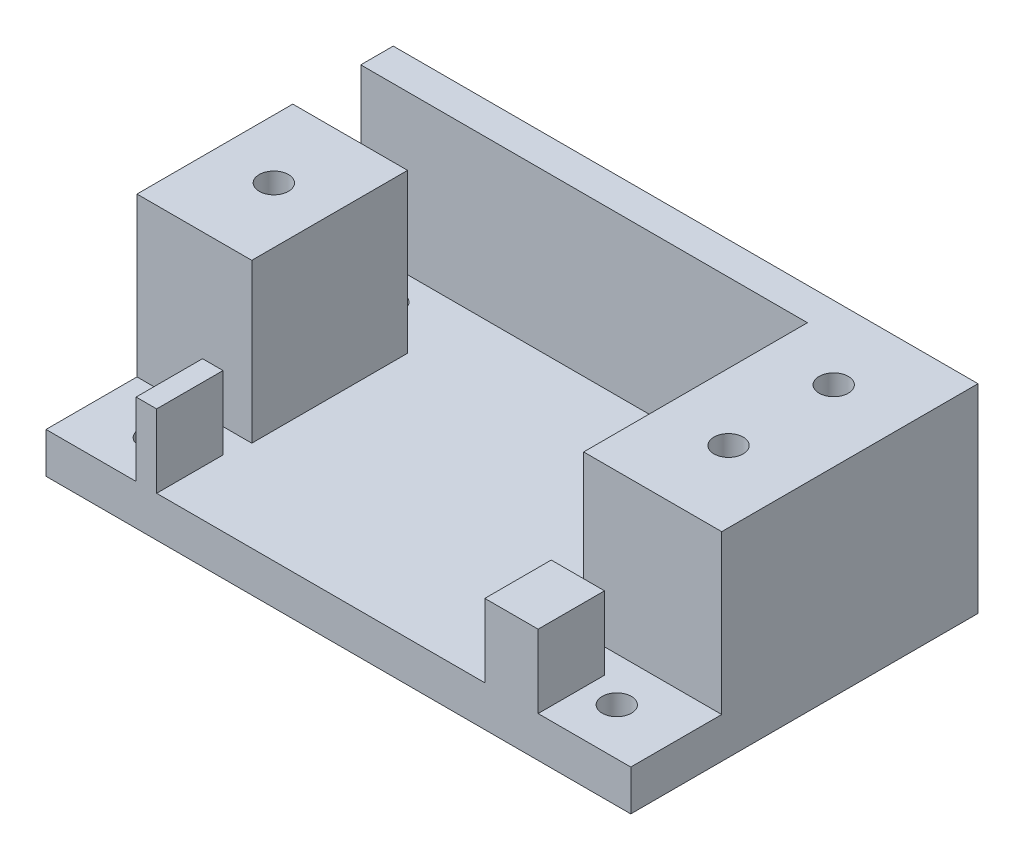
ISO-10303-21;
HEADER;
FILE_DESCRIPTION(('STEP AP214'),'2;1');
FILE_NAME('part.step','',(''),(''),'','','');
FILE_SCHEMA(('AUTOMOTIVE_DESIGN { 1 0 10303 214 1 1 1 1 }'));
ENDSEC;
DATA;
#1=APPLICATION_CONTEXT('core data for automotive mechanical design processes');
#2=APPLICATION_PROTOCOL_DEFINITION('international standard','automotive_design',2000,#1);
#3=PRODUCT_CONTEXT('',#1,'mechanical');
#4=PRODUCT('Part','Part','',(#3));
#5=PRODUCT_RELATED_PRODUCT_CATEGORY('part','',(#4));
#6=PRODUCT_DEFINITION_FORMATION('','',#4);
#7=PRODUCT_DEFINITION_CONTEXT('part definition',#1,'design');
#8=PRODUCT_DEFINITION('design','',#6,#7);
#9=PRODUCT_DEFINITION_SHAPE('','',#8);
#10=(LENGTH_UNIT() NAMED_UNIT(*) SI_UNIT(.MILLI.,.METRE.));
#11=(NAMED_UNIT(*) PLANE_ANGLE_UNIT() SI_UNIT($,.RADIAN.));
#12=(NAMED_UNIT(*) SI_UNIT($,.STERADIAN.) SOLID_ANGLE_UNIT());
#13=UNCERTAINTY_MEASURE_WITH_UNIT(LENGTH_MEASURE(1.E-05),#10,'distance_accuracy_value','');
#14=(GEOMETRIC_REPRESENTATION_CONTEXT(3) GLOBAL_UNCERTAINTY_ASSIGNED_CONTEXT((#13)) GLOBAL_UNIT_ASSIGNED_CONTEXT((#10,
#11,#12)) REPRESENTATION_CONTEXT('',''));
#15=CARTESIAN_POINT('',(0.,0.,0.));
#16=DIRECTION('',(0.,0.,1.));
#17=DIRECTION('',(1.,0.,0.));
#18=AXIS2_PLACEMENT_3D('',#15,#16,#17);
#19=CARTESIAN_POINT('',(0.,5.,0.));
#20=DIRECTION('',(0.,-1.,0.));
#21=DIRECTION('',(0.,0.,-1.));
#22=AXIS2_PLACEMENT_3D('',#19,#20,#21);
#23=PLANE('',#22);
#24=CARTESIAN_POINT('',(7.5,5.,-34.6484862574861));
#25=DIRECTION('',(0.,-1.,0.));
#26=DIRECTION('',(0.,0.,-1.));
#27=AXIS2_PLACEMENT_3D('',#24,#25,#26);
#28=CIRCLE('',#27,1.8);
#29=CARTESIAN_POINT('',(7.5,5.,-36.4484862574861));
#30=VERTEX_POINT('',#29);
#31=EDGE_CURVE('E237',#30,#30,#28,.T.);
#32=ORIENTED_EDGE('',*,*,#31,.T.);
#33=EDGE_LOOP('',(#32));
#34=FACE_BOUND('',#33,.T.);
#35=CARTESIAN_POINT('',(7.5,5.,-5.77830446336364));
#36=DIRECTION('',(0.,-1.,0.));
#37=DIRECTION('',(0.,0.,-1.));
#38=AXIS2_PLACEMENT_3D('',#35,#36,#37);
#39=CIRCLE('',#38,1.8);
#40=CARTESIAN_POINT('',(7.5,5.,-7.57830446336364));
#41=VERTEX_POINT('',#40);
#42=EDGE_CURVE('E234',#41,#41,#39,.T.);
#43=ORIENTED_EDGE('',*,*,#42,.T.);
#44=EDGE_LOOP('',(#43));
#45=FACE_BOUND('',#44,.T.);
#46=CARTESIAN_POINT('',(64.5,5.,-5.77830446336364));
#47=DIRECTION('',(0.,-1.,0.));
#48=DIRECTION('',(0.,0.,-1.));
#49=AXIS2_PLACEMENT_3D('',#46,#47,#48);
#50=CIRCLE('',#49,1.79999999999999);
#51=CARTESIAN_POINT('',(64.5,5.,-7.57830446336364));
#52=VERTEX_POINT('',#51);
#53=EDGE_CURVE('E230',#52,#52,#50,.T.);
#54=ORIENTED_EDGE('',*,*,#53,.T.);
#55=EDGE_LOOP('',(#54));
#56=FACE_BOUND('',#55,.T.);
#57=DIRECTION('',(0.,0.,1.));
#58=VECTOR('',#57,1.);
#59=CARTESIAN_POINT('',(54.030387781093,5.,-8.17719387321514));
#60=LINE('',#59,#58);
#61=CARTESIAN_POINT('',(54.030387781093,5.,-8.17719387321514));
#62=VERTEX_POINT('',#61);
#63=CARTESIAN_POINT('',(54.030387781093,5.,0.));
#64=VERTEX_POINT('',#63);
#65=EDGE_CURVE('E52',#62,#64,#60,.T.);
#66=ORIENTED_EDGE('',*,*,#65,.F.);
#67=DIRECTION('',(-1.,0.,0.));
#68=VECTOR('',#67,1.);
#69=CARTESIAN_POINT('',(54.030387781093,5.,-8.17719387321514));
#70=LINE('',#69,#68);
#71=CARTESIAN_POINT('',(60.5940121736773,5.,-8.17719387321514));
#72=VERTEX_POINT('',#71);
#73=EDGE_CURVE('E56',#72,#62,#70,.T.);
#74=ORIENTED_EDGE('',*,*,#73,.F.);
#75=DIRECTION('',(0.,0.,-1.));
#76=VECTOR('',#75,1.);
#77=CARTESIAN_POINT('',(60.5940121736773,5.,-8.17719387321514));
#78=LINE('',#77,#76);
#79=CARTESIAN_POINT('',(60.5940121736773,5.,0.));
#80=VERTEX_POINT('',#79);
#81=EDGE_CURVE('E363',#80,#72,#78,.T.);
#82=ORIENTED_EDGE('',*,*,#81,.F.);
#83=DIRECTION('',(1.,0.,0.));
#84=VECTOR('',#83,1.);
#85=CARTESIAN_POINT('',(0.,5.,0.));
#86=LINE('',#85,#84);
#87=CARTESIAN_POINT('',(72.,5.,0.));
#88=VERTEX_POINT('',#87);
#89=EDGE_CURVE('E314',#80,#88,#86,.T.);
#90=ORIENTED_EDGE('',*,*,#89,.T.);
#91=DIRECTION('',(0.,0.,-1.));
#92=VECTOR('',#91,1.);
#93=CARTESIAN_POINT('',(72.,5.,0.));
#94=LINE('',#93,#92);
#95=CARTESIAN_POINT('',(72.,5.,-11.2));
#96=VERTEX_POINT('',#95);
#97=EDGE_CURVE('E318',#88,#96,#94,.T.);
#98=ORIENTED_EDGE('',*,*,#97,.T.);
#99=DIRECTION('',(-1.,0.,0.));
#100=VECTOR('',#99,1.);
#101=CARTESIAN_POINT('',(0.,5.,-11.2));
#102=LINE('',#101,#100);
#103=CARTESIAN_POINT('',(55.,5.,-11.2));
#104=VERTEX_POINT('',#103);
#105=EDGE_CURVE('E278',#96,#104,#102,.T.);
#106=ORIENTED_EDGE('',*,*,#105,.T.);
#107=DIRECTION('',(0.,0.,1.));
#108=VECTOR('',#107,1.);
#109=CARTESIAN_POINT('',(55.,5.,0.));
#110=LINE('',#109,#108);
#111=CARTESIAN_POINT('',(55.,5.,-38.7549792026346));
#112=VERTEX_POINT('',#111);
#113=EDGE_CURVE('E275',#112,#104,#110,.T.);
#114=ORIENTED_EDGE('',*,*,#113,.F.);
#115=DIRECTION('',(1.,0.,0.));
#116=VECTOR('',#115,1.);
#117=CARTESIAN_POINT('',(0.,5.,-38.7549792026346));
#118=LINE('',#117,#116);
#119=CARTESIAN_POINT('',(0.,5.,-38.7549792026346));
#120=VERTEX_POINT('',#119);
#121=EDGE_CURVE('E280',#120,#112,#118,.T.);
#122=ORIENTED_EDGE('',*,*,#121,.F.);
#123=DIRECTION('',(0.,0.,1.));
#124=VECTOR('',#123,1.);
#125=CARTESIAN_POINT('',(0.,5.,0.));
#126=LINE('',#125,#124);
#127=CARTESIAN_POINT('',(0.,5.,-30.3868534551371));
#128=VERTEX_POINT('',#127);
#129=EDGE_CURVE('E312',#120,#128,#126,.T.);
#130=ORIENTED_EDGE('',*,*,#129,.T.);
#131=DIRECTION('',(1.,0.,0.));
#132=VECTOR('',#131,1.);
#133=CARTESIAN_POINT('',(0.,5.,-30.3868534551371));
#134=LINE('',#133,#132);
#135=CARTESIAN_POINT('',(14.1358984015401,5.,-30.3868534551371));
#136=VERTEX_POINT('',#135);
#137=EDGE_CURVE('E298',#128,#136,#134,.T.);
#138=ORIENTED_EDGE('',*,*,#137,.T.);
#139=DIRECTION('',(0.,0.,1.));
#140=VECTOR('',#139,1.);
#141=CARTESIAN_POINT('',(14.1358984015401,5.,0.));
#142=LINE('',#141,#140);
#143=CARTESIAN_POINT('',(14.1358984015401,5.,-11.1999999999585));
#144=VERTEX_POINT('',#143);
#145=EDGE_CURVE('E308',#136,#144,#142,.T.);
#146=ORIENTED_EDGE('',*,*,#145,.T.);
#147=DIRECTION('',(1.,0.,0.));
#148=VECTOR('',#147,1.);
#149=CARTESIAN_POINT('',(0.,5.,-11.1999999999585));
#150=LINE('',#149,#148);
#151=CARTESIAN_POINT('',(0.,5.,-11.1999999999585));
#152=VERTEX_POINT('',#151);
#153=EDGE_CURVE('E306',#152,#144,#150,.T.);
#154=ORIENTED_EDGE('',*,*,#153,.F.);
#155=CARTESIAN_POINT('',(0.,5.,0.));
#156=VERTEX_POINT('',#155);
#157=EDGE_CURVE('E315',#152,#156,#126,.T.);
#158=ORIENTED_EDGE('',*,*,#157,.T.);
#159=CARTESIAN_POINT('',(11.0932438057328,5.,0.));
#160=VERTEX_POINT('',#159);
#161=EDGE_CURVE('E316',#156,#160,#86,.T.);
#162=ORIENTED_EDGE('',*,*,#161,.T.);
#163=DIRECTION('',(0.,0.,1.));
#164=VECTOR('',#163,1.);
#165=CARTESIAN_POINT('',(11.0932438057328,5.,-8.17719387321514));
#166=LINE('',#165,#164);
#167=CARTESIAN_POINT('',(11.0932438057328,5.,-8.17719387321514));
#168=VERTEX_POINT('',#167);
#169=EDGE_CURVE('E194',#168,#160,#166,.T.);
#170=ORIENTED_EDGE('',*,*,#169,.F.);
#171=DIRECTION('',(-1.,0.,0.));
#172=VECTOR('',#171,1.);
#173=CARTESIAN_POINT('',(11.0932438057328,5.,-8.17719387321514));
#174=LINE('',#173,#172);
#175=CARTESIAN_POINT('',(13.620480519598,5.,-8.17719387321514));
#176=VERTEX_POINT('',#175);
#177=EDGE_CURVE('E207',#176,#168,#174,.T.);
#178=ORIENTED_EDGE('',*,*,#177,.F.);
#179=DIRECTION('',(0.,0.,-1.));
#180=VECTOR('',#179,1.);
#181=CARTESIAN_POINT('',(13.620480519598,5.,-8.17719387321514));
#182=LINE('',#181,#180);
#183=CARTESIAN_POINT('',(13.620480519598,5.,0.));
#184=VERTEX_POINT('',#183);
#185=EDGE_CURVE('E197',#184,#176,#182,.T.);
#186=ORIENTED_EDGE('',*,*,#185,.F.);
#187=EDGE_CURVE('E319',#184,#64,#86,.T.);
#188=ORIENTED_EDGE('',*,*,#187,.T.);
#189=EDGE_LOOP('',(#66,#74,#82,#90,#98,#106,#114,#122,#130,#138,#146,#154,#158,#162,#170,#178,
#186,#188));
#190=FACE_BOUND('',#189,.T.);
#191=ADVANCED_FACE('F35',(#34,#45,#56,#190),#23,.F.);
#192=CARTESIAN_POINT('',(0.,5.,0.));
#193=DIRECTION('',(1.,0.,0.));
#194=DIRECTION('',(0.,0.,-1.));
#195=AXIS2_PLACEMENT_3D('',#192,#193,#194);
#196=PLANE('',#195);
#197=ORIENTED_EDGE('',*,*,#129,.F.);
#198=DIRECTION('',(0.,-1.,0.));
#199=VECTOR('',#198,1.);
#200=CARTESIAN_POINT('',(0.,24.5,-38.7549792026346));
#201=LINE('',#200,#199);
#202=CARTESIAN_POINT('',(0.,24.5,-38.7549792026346));
#203=VERTEX_POINT('',#202);
#204=EDGE_CURVE('E254',#203,#120,#201,.T.);
#205=ORIENTED_EDGE('',*,*,#204,.F.);
#206=DIRECTION('',(0.,0.,1.));
#207=VECTOR('',#206,1.);
#208=CARTESIAN_POINT('',(0.,24.5,-42.7549792026346));
#209=LINE('',#208,#207);
#210=CARTESIAN_POINT('',(0.,24.5,-42.7549792026346));
#211=VERTEX_POINT('',#210);
#212=EDGE_CURVE('E269',#211,#203,#209,.T.);
#213=ORIENTED_EDGE('',*,*,#212,.F.);
#214=DIRECTION('',(0.,-1.,0.));
#215=VECTOR('',#214,1.);
#216=CARTESIAN_POINT('',(0.,24.5,-42.7549792026346));
#217=LINE('',#216,#215);
#218=CARTESIAN_POINT('',(0.,0.,-42.7549792026346));
#219=VERTEX_POINT('',#218);
#220=EDGE_CURVE('E260',#211,#219,#217,.T.);
#221=ORIENTED_EDGE('',*,*,#220,.T.);
#222=DIRECTION('',(0.,0.,1.));
#223=VECTOR('',#222,1.);
#224=CARTESIAN_POINT('',(0.,0.,0.));
#225=LINE('',#224,#223);
#226=CARTESIAN_POINT('',(0.,0.,0.));
#227=VERTEX_POINT('',#226);
#228=EDGE_CURVE('E311',#219,#227,#225,.T.);
#229=ORIENTED_EDGE('',*,*,#228,.T.);
#230=DIRECTION('',(0.,-1.,0.));
#231=VECTOR('',#230,1.);
#232=CARTESIAN_POINT('',(0.,5.,0.));
#233=LINE('',#232,#231);
#234=EDGE_CURVE('E11',#156,#227,#233,.T.);
#235=ORIENTED_EDGE('',*,*,#234,.F.);
#236=ORIENTED_EDGE('',*,*,#157,.F.);
#237=DIRECTION('',(0.,1.,0.));
#238=VECTOR('',#237,1.);
#239=CARTESIAN_POINT('',(0.,0.,-11.1999999999585));
#240=LINE('',#239,#238);
#241=CARTESIAN_POINT('',(0.,24.5,-11.1999999999585));
#242=VERTEX_POINT('',#241);
#243=EDGE_CURVE('E299',#152,#242,#240,.T.);
#244=ORIENTED_EDGE('',*,*,#243,.T.);
#245=DIRECTION('',(0.,0.,1.));
#246=VECTOR('',#245,1.);
#247=CARTESIAN_POINT('',(0.,24.5,0.));
#248=LINE('',#247,#246);
#249=CARTESIAN_POINT('',(0.,24.5,-30.3868534551371));
#250=VERTEX_POINT('',#249);
#251=EDGE_CURVE('E289',#250,#242,#248,.T.);
#252=ORIENTED_EDGE('',*,*,#251,.F.);
#253=DIRECTION('',(0.,1.,0.));
#254=VECTOR('',#253,1.);
#255=CARTESIAN_POINT('',(0.,0.,-30.3868534551371));
#256=LINE('',#255,#254);
#257=EDGE_CURVE('E301',#128,#250,#256,.T.);
#258=ORIENTED_EDGE('',*,*,#257,.F.);
#259=EDGE_LOOP('',(#197,#205,#213,#221,#229,#235,#236,#244,#252,#258));
#260=FACE_BOUND('',#259,.T.);
#261=ADVANCED_FACE('F37',(#260),#196,.F.);
#262=CARTESIAN_POINT('',(0.,5.,0.));
#263=DIRECTION('',(0.,0.,-1.));
#264=DIRECTION('',(-1.,0.,0.));
#265=AXIS2_PLACEMENT_3D('',#262,#263,#264);
#266=PLANE('',#265);
#267=DIRECTION('',(1.,0.,0.));
#268=VECTOR('',#267,1.);
#269=CARTESIAN_POINT('',(0.,0.,0.));
#270=LINE('',#269,#268);
#271=CARTESIAN_POINT('',(72.,0.,0.));
#272=VERTEX_POINT('',#271);
#273=EDGE_CURVE('E322',#227,#272,#270,.T.);
#274=ORIENTED_EDGE('',*,*,#273,.T.);
#275=DIRECTION('',(0.,-1.,0.));
#276=VECTOR('',#275,1.);
#277=CARTESIAN_POINT('',(72.,5.,0.));
#278=LINE('',#277,#276);
#279=EDGE_CURVE('E44',#88,#272,#278,.T.);
#280=ORIENTED_EDGE('',*,*,#279,.F.);
#281=ORIENTED_EDGE('',*,*,#89,.F.);
#282=DIRECTION('',(0.,-1.,0.));
#283=VECTOR('',#282,1.);
#284=CARTESIAN_POINT('',(60.5940121736773,14.,0.));
#285=LINE('',#284,#283);
#286=CARTESIAN_POINT('',(60.5940121736773,14.,0.));
#287=VERTEX_POINT('',#286);
#288=EDGE_CURVE('E179',#287,#80,#285,.T.);
#289=ORIENTED_EDGE('',*,*,#288,.F.);
#290=DIRECTION('',(1.,0.,0.));
#291=VECTOR('',#290,1.);
#292=CARTESIAN_POINT('',(54.030387781093,14.,0.));
#293=LINE('',#292,#291);
#294=CARTESIAN_POINT('',(54.030387781093,14.,0.));
#295=VERTEX_POINT('',#294);
#296=EDGE_CURVE('E173',#295,#287,#293,.T.);
#297=ORIENTED_EDGE('',*,*,#296,.F.);
#298=DIRECTION('',(0.,-1.,0.));
#299=VECTOR('',#298,1.);
#300=CARTESIAN_POINT('',(54.030387781093,14.,0.));
#301=LINE('',#300,#299);
#302=EDGE_CURVE('E177',#295,#64,#301,.T.);
#303=ORIENTED_EDGE('',*,*,#302,.T.);
#304=ORIENTED_EDGE('',*,*,#187,.F.);
#305=DIRECTION('',(0.,-1.,0.));
#306=VECTOR('',#305,1.);
#307=CARTESIAN_POINT('',(13.620480519598,14.,0.));
#308=LINE('',#307,#306);
#309=CARTESIAN_POINT('',(13.620480519598,14.,0.));
#310=VERTEX_POINT('',#309);
#311=EDGE_CURVE('E223',#310,#184,#308,.T.);
#312=ORIENTED_EDGE('',*,*,#311,.F.);
#313=DIRECTION('',(1.,0.,0.));
#314=VECTOR('',#313,1.);
#315=CARTESIAN_POINT('',(11.0932438057328,14.,0.));
#316=LINE('',#315,#314);
#317=CARTESIAN_POINT('',(11.0932438057328,14.,0.));
#318=VERTEX_POINT('',#317);
#319=EDGE_CURVE('E206',#318,#310,#316,.T.);
#320=ORIENTED_EDGE('',*,*,#319,.F.);
#321=DIRECTION('',(0.,-1.,0.));
#322=VECTOR('',#321,1.);
#323=CARTESIAN_POINT('',(11.0932438057328,14.,0.));
#324=LINE('',#323,#322);
#325=EDGE_CURVE('E226',#318,#160,#324,.T.);
#326=ORIENTED_EDGE('',*,*,#325,.T.);
#327=ORIENTED_EDGE('',*,*,#161,.F.);
#328=ORIENTED_EDGE('',*,*,#234,.T.);
#329=EDGE_LOOP('',(#274,#280,#281,#289,#297,#303,#304,#312,#320,#326,#327,#328));
#330=FACE_BOUND('',#329,.T.);
#331=ADVANCED_FACE('F175',(#330),#266,.F.);
#332=CARTESIAN_POINT('',(72.,5.,0.));
#333=DIRECTION('',(-1.,0.,0.));
#334=DIRECTION('',(0.,0.,1.));
#335=AXIS2_PLACEMENT_3D('',#332,#333,#334);
#336=PLANE('',#335);
#337=DIRECTION('',(0.,1.,0.));
#338=VECTOR('',#337,1.);
#339=CARTESIAN_POINT('',(72.,0.,-11.2));
#340=LINE('',#339,#338);
#341=CARTESIAN_POINT('',(72.,24.5,-11.2));
#342=VERTEX_POINT('',#341);
#343=EDGE_CURVE('E240',#96,#342,#340,.T.);
#344=ORIENTED_EDGE('',*,*,#343,.F.);
#345=ORIENTED_EDGE('',*,*,#97,.F.);
#346=ORIENTED_EDGE('',*,*,#279,.T.);
#347=DIRECTION('',(0.,0.,-1.));
#348=VECTOR('',#347,1.);
#349=CARTESIAN_POINT('',(72.,0.,0.));
#350=LINE('',#349,#348);
#351=CARTESIAN_POINT('',(72.,0.,-42.7549792026346));
#352=VERTEX_POINT('',#351);
#353=EDGE_CURVE('E324',#272,#352,#350,.T.);
#354=ORIENTED_EDGE('',*,*,#353,.T.);
#355=DIRECTION('',(0.,-1.,0.));
#356=VECTOR('',#355,1.);
#357=CARTESIAN_POINT('',(72.,24.5,-42.7549792026346));
#358=LINE('',#357,#356);
#359=CARTESIAN_POINT('',(72.,24.5,-42.7549792026346));
#360=VERTEX_POINT('',#359);
#361=EDGE_CURVE('E257',#360,#352,#358,.T.);
#362=ORIENTED_EDGE('',*,*,#361,.F.);
#363=DIRECTION('',(0.,0.,-1.));
#364=VECTOR('',#363,1.);
#365=CARTESIAN_POINT('',(72.,24.5,0.));
#366=LINE('',#365,#364);
#367=EDGE_CURVE('E243',#342,#360,#366,.T.);
#368=ORIENTED_EDGE('',*,*,#367,.F.);
#369=EDGE_LOOP('',(#344,#345,#346,#354,#362,#368));
#370=FACE_BOUND('',#369,.T.);
#371=ADVANCED_FACE('F339',(#370),#336,.F.);
#372=CARTESIAN_POINT('',(0.,0.,0.));
#373=DIRECTION('',(0.,-1.,0.));
#374=DIRECTION('',(0.,0.,-1.));
#375=AXIS2_PLACEMENT_3D('',#372,#373,#374);
#376=PLANE('',#375);
#377=CARTESIAN_POINT('',(7.2440769767815,0.,-20.8097057142761));
#378=DIRECTION('',(0.,-1.,0.));
#379=DIRECTION('',(0.,0.,-1.));
#380=AXIS2_PLACEMENT_3D('',#377,#378,#379);
#381=CIRCLE('',#380,1.8);
#382=CARTESIAN_POINT('',(7.2440769767815,0.,-22.6097057142761));
#383=VERTEX_POINT('',#382);
#384=EDGE_CURVE('E373',#383,#383,#381,.T.);
#385=ORIENTED_EDGE('',*,*,#384,.F.);
#386=EDGE_LOOP('',(#385));
#387=FACE_BOUND('',#386,.T.);
#388=CARTESIAN_POINT('',(63.2344456145826,0.,-20.8097057142761));
#389=DIRECTION('',(0.,-1.,0.));
#390=DIRECTION('',(0.,0.,-1.));
#391=AXIS2_PLACEMENT_3D('',#388,#389,#390);
#392=CIRCLE('',#391,1.79999999999999);
#393=CARTESIAN_POINT('',(63.2344456145826,0.,-22.6097057142761));
#394=VERTEX_POINT('',#393);
#395=EDGE_CURVE('E595',#394,#394,#392,.T.);
#396=ORIENTED_EDGE('',*,*,#395,.F.);
#397=EDGE_LOOP('',(#396));
#398=FACE_BOUND('',#397,.T.);
#399=CARTESIAN_POINT('',(63.2344456145826,0.,-33.7549792));
#400=DIRECTION('',(0.,-1.,0.));
#401=DIRECTION('',(0.,0.,-1.));
#402=AXIS2_PLACEMENT_3D('',#399,#400,#401);
#403=CIRCLE('',#402,1.79999999999999);
#404=CARTESIAN_POINT('',(63.2344456145826,0.,-35.5549792));
#405=VERTEX_POINT('',#404);
#406=EDGE_CURVE('E591',#405,#405,#403,.T.);
#407=ORIENTED_EDGE('',*,*,#406,.F.);
#408=EDGE_LOOP('',(#407));
#409=FACE_BOUND('',#408,.T.);
#410=CARTESIAN_POINT('',(7.5,0.,-34.6484862574861));
#411=DIRECTION('',(0.,-1.,0.));
#412=DIRECTION('',(0.,0.,-1.));
#413=AXIS2_PLACEMENT_3D('',#410,#411,#412);
#414=CIRCLE('',#413,1.8);
#415=CARTESIAN_POINT('',(7.5,0.,-36.4484862574861));
#416=VERTEX_POINT('',#415);
#417=EDGE_CURVE('E39',#416,#416,#414,.T.);
#418=ORIENTED_EDGE('',*,*,#417,.F.);
#419=EDGE_LOOP('',(#418));
#420=FACE_BOUND('',#419,.T.);
#421=CARTESIAN_POINT('',(7.5,0.,-5.77830446336364));
#422=DIRECTION('',(0.,-1.,0.));
#423=DIRECTION('',(0.,0.,-1.));
#424=AXIS2_PLACEMENT_3D('',#421,#422,#423);
#425=CIRCLE('',#424,1.8);
#426=CARTESIAN_POINT('',(7.5,0.,-7.57830446336364));
#427=VERTEX_POINT('',#426);
#428=EDGE_CURVE('E233',#427,#427,#425,.T.);
#429=ORIENTED_EDGE('',*,*,#428,.F.);
#430=EDGE_LOOP('',(#429));
#431=FACE_BOUND('',#430,.T.);
#432=CARTESIAN_POINT('',(64.5,0.,-5.77830446336364));
#433=DIRECTION('',(0.,-1.,0.));
#434=DIRECTION('',(0.,0.,-1.));
#435=AXIS2_PLACEMENT_3D('',#432,#433,#434);
#436=CIRCLE('',#435,1.79999999999999);
#437=CARTESIAN_POINT('',(64.5,0.,-7.57830446336364));
#438=VERTEX_POINT('',#437);
#439=EDGE_CURVE('E229',#438,#438,#436,.T.);
#440=ORIENTED_EDGE('',*,*,#439,.F.);
#441=EDGE_LOOP('',(#440));
#442=FACE_BOUND('',#441,.T.);
#443=ORIENTED_EDGE('',*,*,#273,.F.);
#444=ORIENTED_EDGE('',*,*,#228,.F.);
#445=DIRECTION('',(1.,0.,0.));
#446=VECTOR('',#445,1.);
#447=CARTESIAN_POINT('',(0.,0.,-42.7549792026346));
#448=LINE('',#447,#446);
#449=EDGE_CURVE('E272',#219,#352,#448,.T.);
#450=ORIENTED_EDGE('',*,*,#449,.T.);
#451=ORIENTED_EDGE('',*,*,#353,.F.);
#452=EDGE_LOOP('',(#443,#444,#450,#451));
#453=FACE_BOUND('',#452,.T.);
#454=ADVANCED_FACE('F335',(#387,#398,#409,#420,#431,#442,#453),#376,.T.);
#455=CARTESIAN_POINT('',(14.1358984015401,0.,0.));
#456=DIRECTION('',(1.,0.,0.));
#457=DIRECTION('',(0.,0.,-1.));
#458=AXIS2_PLACEMENT_3D('',#455,#456,#457);
#459=PLANE('',#458);
#460=ORIENTED_EDGE('',*,*,#145,.F.);
#461=DIRECTION('',(0.,1.,0.));
#462=VECTOR('',#461,1.);
#463=CARTESIAN_POINT('',(14.1358984015401,0.,-30.3868534551371));
#464=LINE('',#463,#462);
#465=CARTESIAN_POINT('',(14.1358984015401,24.5,-30.3868534551371));
#466=VERTEX_POINT('',#465);
#467=EDGE_CURVE('E295',#136,#466,#464,.T.);
#468=ORIENTED_EDGE('',*,*,#467,.T.);
#469=DIRECTION('',(0.,0.,-1.));
#470=VECTOR('',#469,1.);
#471=CARTESIAN_POINT('',(14.1358984015401,24.5,0.));
#472=LINE('',#471,#470);
#473=CARTESIAN_POINT('',(14.1358984015401,24.5,-11.1999999999585));
#474=VERTEX_POINT('',#473);
#475=EDGE_CURVE('E283',#474,#466,#472,.T.);
#476=ORIENTED_EDGE('',*,*,#475,.F.);
#477=DIRECTION('',(0.,1.,0.));
#478=VECTOR('',#477,1.);
#479=CARTESIAN_POINT('',(14.1358984015401,0.,-11.1999999999585));
#480=LINE('',#479,#478);
#481=EDGE_CURVE('E296',#144,#474,#480,.T.);
#482=ORIENTED_EDGE('',*,*,#481,.F.);
#483=EDGE_LOOP('',(#460,#468,#476,#482));
#484=FACE_BOUND('',#483,.T.);
#485=ADVANCED_FACE('F338',(#484),#459,.T.);
#486=CARTESIAN_POINT('',(0.,0.,-11.1999999999585));
#487=DIRECTION('',(0.,0.,-1.));
#488=DIRECTION('',(-1.,0.,0.));
#489=AXIS2_PLACEMENT_3D('',#486,#487,#488);
#490=PLANE('',#489);
#491=ORIENTED_EDGE('',*,*,#243,.F.);
#492=ORIENTED_EDGE('',*,*,#153,.T.);
#493=ORIENTED_EDGE('',*,*,#481,.T.);
#494=DIRECTION('',(-1.,0.,0.));
#495=VECTOR('',#494,1.);
#496=CARTESIAN_POINT('',(0.,24.5,-11.1999999999585));
#497=LINE('',#496,#495);
#498=EDGE_CURVE('E292',#474,#242,#497,.T.);
#499=ORIENTED_EDGE('',*,*,#498,.T.);
#500=EDGE_LOOP('',(#491,#492,#493,#499));
#501=FACE_BOUND('',#500,.T.);
#502=ADVANCED_FACE('F420',(#501),#490,.F.);
#503=CARTESIAN_POINT('',(0.,0.,-30.3868534551371));
#504=DIRECTION('',(0.,0.,-1.));
#505=DIRECTION('',(-1.,0.,0.));
#506=AXIS2_PLACEMENT_3D('',#503,#504,#505);
#507=PLANE('',#506);
#508=ORIENTED_EDGE('',*,*,#137,.F.);
#509=ORIENTED_EDGE('',*,*,#257,.T.);
#510=DIRECTION('',(-1.,0.,0.));
#511=VECTOR('',#510,1.);
#512=CARTESIAN_POINT('',(0.,24.5,-30.3868534551371));
#513=LINE('',#512,#511);
#514=EDGE_CURVE('E286',#466,#250,#513,.T.);
#515=ORIENTED_EDGE('',*,*,#514,.F.);
#516=ORIENTED_EDGE('',*,*,#467,.F.);
#517=EDGE_LOOP('',(#508,#509,#515,#516));
#518=FACE_BOUND('',#517,.T.);
#519=ADVANCED_FACE('F427',(#518),#507,.T.);
#520=CARTESIAN_POINT('',(0.,24.5,0.));
#521=DIRECTION('',(0.,1.,0.));
#522=DIRECTION('',(0.,0.,1.));
#523=AXIS2_PLACEMENT_3D('',#520,#521,#522);
#524=PLANE('',#523);
#525=CARTESIAN_POINT('',(7.2440769767815,24.5,-20.8097057142761));
#526=DIRECTION('',(0.,1.,0.));
#527=DIRECTION('',(0.,0.,1.));
#528=AXIS2_PLACEMENT_3D('',#525,#526,#527);
#529=CIRCLE('',#528,1.8);
#530=CARTESIAN_POINT('',(7.2440769767815,24.5,-19.0097057142761));
#531=VERTEX_POINT('',#530);
#532=EDGE_CURVE('E590',#531,#531,#529,.T.);
#533=ORIENTED_EDGE('',*,*,#532,.F.);
#534=EDGE_LOOP('',(#533));
#535=FACE_BOUND('',#534,.T.);
#536=ORIENTED_EDGE('',*,*,#475,.T.);
#537=ORIENTED_EDGE('',*,*,#514,.T.);
#538=ORIENTED_EDGE('',*,*,#251,.T.);
#539=ORIENTED_EDGE('',*,*,#498,.F.);
#540=EDGE_LOOP('',(#536,#537,#538,#539));
#541=FACE_BOUND('',#540,.T.);
#542=ADVANCED_FACE('F435',(#535,#541),#524,.T.);
#543=CARTESIAN_POINT('',(0.,24.5,-38.7549792026346));
#544=DIRECTION('',(0.,0.,-1.));
#545=DIRECTION('',(-1.,0.,0.));
#546=AXIS2_PLACEMENT_3D('',#543,#544,#545);
#547=PLANE('',#546);
#548=ORIENTED_EDGE('',*,*,#204,.T.);
#549=ORIENTED_EDGE('',*,*,#121,.T.);
#550=DIRECTION('',(0.,1.,0.));
#551=VECTOR('',#550,1.);
#552=CARTESIAN_POINT('',(55.,0.,-38.7549792026346));
#553=LINE('',#552,#551);
#554=CARTESIAN_POINT('',(55.,24.5,-38.7549792026346));
#555=VERTEX_POINT('',#554);
#556=EDGE_CURVE('E241',#112,#555,#553,.T.);
#557=ORIENTED_EDGE('',*,*,#556,.T.);
#558=DIRECTION('',(1.,0.,0.));
#559=VECTOR('',#558,1.);
#560=CARTESIAN_POINT('',(0.,24.5,-38.7549792026346));
#561=LINE('',#560,#559);
#562=EDGE_CURVE('E266',#203,#555,#561,.T.);
#563=ORIENTED_EDGE('',*,*,#562,.F.);
#564=EDGE_LOOP('',(#548,#549,#557,#563));
#565=FACE_BOUND('',#564,.T.);
#566=ADVANCED_FACE('F442',(#565),#547,.F.);
#567=CARTESIAN_POINT('',(0.,0.,-11.2));
#568=DIRECTION('',(0.,0.,1.));
#569=DIRECTION('',(1.,0.,0.));
#570=AXIS2_PLACEMENT_3D('',#567,#568,#569);
#571=PLANE('',#570);
#572=ORIENTED_EDGE('',*,*,#105,.F.);
#573=ORIENTED_EDGE('',*,*,#343,.T.);
#574=DIRECTION('',(1.,0.,0.));
#575=VECTOR('',#574,1.);
#576=CARTESIAN_POINT('',(0.,24.5,-11.2));
#577=LINE('',#576,#575);
#578=CARTESIAN_POINT('',(55.,24.5,-11.2));
#579=VERTEX_POINT('',#578);
#580=EDGE_CURVE('E248',#579,#342,#577,.T.);
#581=ORIENTED_EDGE('',*,*,#580,.F.);
#582=DIRECTION('',(0.,1.,0.));
#583=VECTOR('',#582,1.);
#584=CARTESIAN_POINT('',(55.,0.,-11.2));
#585=LINE('',#584,#583);
#586=EDGE_CURVE('E244',#104,#579,#585,.T.);
#587=ORIENTED_EDGE('',*,*,#586,.F.);
#588=EDGE_LOOP('',(#572,#573,#581,#587));
#589=FACE_BOUND('',#588,.T.);
#590=ADVANCED_FACE('F450',(#589),#571,.T.);
#591=CARTESIAN_POINT('',(55.,0.,0.));
#592=DIRECTION('',(1.,0.,0.));
#593=DIRECTION('',(0.,0.,-1.));
#594=AXIS2_PLACEMENT_3D('',#591,#592,#593);
#595=PLANE('',#594);
#596=ORIENTED_EDGE('',*,*,#556,.F.);
#597=ORIENTED_EDGE('',*,*,#113,.T.);
#598=ORIENTED_EDGE('',*,*,#586,.T.);
#599=DIRECTION('',(0.,0.,-1.));
#600=VECTOR('',#599,1.);
#601=CARTESIAN_POINT('',(55.,24.5,0.));
#602=LINE('',#601,#600);
#603=EDGE_CURVE('E251',#579,#555,#602,.T.);
#604=ORIENTED_EDGE('',*,*,#603,.T.);
#605=EDGE_LOOP('',(#596,#597,#598,#604));
#606=FACE_BOUND('',#605,.T.);
#607=ADVANCED_FACE('F458',(#606),#595,.F.);
#608=CARTESIAN_POINT('',(0.,24.5,0.));
#609=DIRECTION('',(0.,1.,0.));
#610=DIRECTION('',(0.,0.,1.));
#611=AXIS2_PLACEMENT_3D('',#608,#609,#610);
#612=PLANE('',#611);
#613=CARTESIAN_POINT('',(63.2344456145826,24.5,-20.8097057142761));
#614=DIRECTION('',(0.,1.,0.));
#615=DIRECTION('',(0.,0.,1.));
#616=AXIS2_PLACEMENT_3D('',#613,#614,#615);
#617=CIRCLE('',#616,1.79999999999999);
#618=CARTESIAN_POINT('',(63.2344456145826,24.5,-19.0097057142761));
#619=VERTEX_POINT('',#618);
#620=EDGE_CURVE('E592',#619,#619,#617,.T.);
#621=ORIENTED_EDGE('',*,*,#620,.F.);
#622=EDGE_LOOP('',(#621));
#623=FACE_BOUND('',#622,.T.);
#624=CARTESIAN_POINT('',(63.2344456145826,24.5,-33.7549792));
#625=DIRECTION('',(0.,1.,0.));
#626=DIRECTION('',(0.,0.,1.));
#627=AXIS2_PLACEMENT_3D('',#624,#625,#626);
#628=CIRCLE('',#627,1.79999999999999);
#629=CARTESIAN_POINT('',(63.2344456145826,24.5,-31.9549792));
#630=VERTEX_POINT('',#629);
#631=EDGE_CURVE('E598',#630,#630,#628,.T.);
#632=ORIENTED_EDGE('',*,*,#631,.F.);
#633=EDGE_LOOP('',(#632));
#634=FACE_BOUND('',#633,.T.);
#635=ORIENTED_EDGE('',*,*,#367,.T.);
#636=DIRECTION('',(1.,0.,0.));
#637=VECTOR('',#636,1.);
#638=CARTESIAN_POINT('',(0.,24.5,-42.7549792026346));
#639=LINE('',#638,#637);
#640=EDGE_CURVE('E263',#211,#360,#639,.T.);
#641=ORIENTED_EDGE('',*,*,#640,.F.);
#642=ORIENTED_EDGE('',*,*,#212,.T.);
#643=ORIENTED_EDGE('',*,*,#562,.T.);
#644=ORIENTED_EDGE('',*,*,#603,.F.);
#645=ORIENTED_EDGE('',*,*,#580,.T.);
#646=EDGE_LOOP('',(#635,#641,#642,#643,#644,#645));
#647=FACE_BOUND('',#646,.T.);
#648=ADVANCED_FACE('F466',(#623,#634,#647),#612,.T.);
#649=CARTESIAN_POINT('',(0.,24.5,-42.7549792026346));
#650=DIRECTION('',(0.,0.,-1.));
#651=DIRECTION('',(-1.,0.,0.));
#652=AXIS2_PLACEMENT_3D('',#649,#650,#651);
#653=PLANE('',#652);
#654=ORIENTED_EDGE('',*,*,#361,.T.);
#655=ORIENTED_EDGE('',*,*,#449,.F.);
#656=ORIENTED_EDGE('',*,*,#220,.F.);
#657=ORIENTED_EDGE('',*,*,#640,.T.);
#658=EDGE_LOOP('',(#654,#655,#656,#657));
#659=FACE_BOUND('',#658,.T.);
#660=ADVANCED_FACE('F357',(#659),#653,.T.);
#661=CARTESIAN_POINT('',(64.5,-5.5,-5.77830446336364));
#662=DIRECTION('',(0.,1.,0.));
#663=DIRECTION('',(0.,0.,1.));
#664=AXIS2_PLACEMENT_3D('',#661,#662,#663);
#665=CYLINDRICAL_SURFACE('',#664,1.79999999999999);
#666=ORIENTED_EDGE('',*,*,#439,.T.);
#667=EDGE_LOOP('',(#666));
#668=FACE_BOUND('',#667,.T.);
#669=ORIENTED_EDGE('',*,*,#53,.F.);
#670=EDGE_LOOP('',(#669));
#671=FACE_BOUND('',#670,.T.);
#672=ADVANCED_FACE('F481',(#668,#671),#665,.F.);
#673=CARTESIAN_POINT('',(7.5,-5.5,-5.77830446336364));
#674=DIRECTION('',(0.,1.,0.));
#675=DIRECTION('',(0.,0.,1.));
#676=AXIS2_PLACEMENT_3D('',#673,#674,#675);
#677=CYLINDRICAL_SURFACE('',#676,1.8);
#678=ORIENTED_EDGE('',*,*,#428,.T.);
#679=EDGE_LOOP('',(#678));
#680=FACE_BOUND('',#679,.T.);
#681=ORIENTED_EDGE('',*,*,#42,.F.);
#682=EDGE_LOOP('',(#681));
#683=FACE_BOUND('',#682,.T.);
#684=ADVANCED_FACE('F332',(#680,#683),#677,.F.);
#685=CARTESIAN_POINT('',(7.5,-5.5,-34.6484862574861));
#686=DIRECTION('',(0.,1.,0.));
#687=DIRECTION('',(0.,0.,1.));
#688=AXIS2_PLACEMENT_3D('',#685,#686,#687);
#689=CYLINDRICAL_SURFACE('',#688,1.8);
#690=ORIENTED_EDGE('',*,*,#417,.T.);
#691=EDGE_LOOP('',(#690));
#692=FACE_BOUND('',#691,.T.);
#693=ORIENTED_EDGE('',*,*,#31,.F.);
#694=EDGE_LOOP('',(#693));
#695=FACE_BOUND('',#694,.T.);
#696=ADVANCED_FACE('F495',(#692,#695),#689,.F.);
#697=CARTESIAN_POINT('',(11.0932438057328,14.,-8.17719387321514));
#698=DIRECTION('',(1.,0.,0.));
#699=DIRECTION('',(0.,0.,-1.));
#700=AXIS2_PLACEMENT_3D('',#697,#698,#699);
#701=PLANE('',#700);
#702=ORIENTED_EDGE('',*,*,#169,.T.);
#703=ORIENTED_EDGE('',*,*,#325,.F.);
#704=DIRECTION('',(0.,0.,1.));
#705=VECTOR('',#704,1.);
#706=CARTESIAN_POINT('',(11.0932438057328,14.,-8.17719387321514));
#707=LINE('',#706,#705);
#708=CARTESIAN_POINT('',(11.0932438057328,14.,-8.17719387321514));
#709=VERTEX_POINT('',#708);
#710=EDGE_CURVE('E203',#709,#318,#707,.T.);
#711=ORIENTED_EDGE('',*,*,#710,.F.);
#712=DIRECTION('',(0.,-1.,0.));
#713=VECTOR('',#712,1.);
#714=CARTESIAN_POINT('',(11.0932438057328,14.,-8.17719387321514));
#715=LINE('',#714,#713);
#716=EDGE_CURVE('E212',#709,#168,#715,.T.);
#717=ORIENTED_EDGE('',*,*,#716,.T.);
#718=EDGE_LOOP('',(#702,#703,#711,#717));
#719=FACE_BOUND('',#718,.T.);
#720=ADVANCED_FACE('F502',(#719),#701,.F.);
#721=CARTESIAN_POINT('',(13.620480519598,14.,-8.17719387321514));
#722=DIRECTION('',(-1.,0.,0.));
#723=DIRECTION('',(0.,0.,1.));
#724=AXIS2_PLACEMENT_3D('',#721,#722,#723);
#725=PLANE('',#724);
#726=ORIENTED_EDGE('',*,*,#185,.T.);
#727=DIRECTION('',(0.,-1.,0.));
#728=VECTOR('',#727,1.);
#729=CARTESIAN_POINT('',(13.620480519598,14.,-8.17719387321514));
#730=LINE('',#729,#728);
#731=CARTESIAN_POINT('',(13.620480519598,14.,-8.17719387321514));
#732=VERTEX_POINT('',#731);
#733=EDGE_CURVE('E220',#732,#176,#730,.T.);
#734=ORIENTED_EDGE('',*,*,#733,.F.);
#735=DIRECTION('',(0.,0.,-1.));
#736=VECTOR('',#735,1.);
#737=CARTESIAN_POINT('',(13.620480519598,14.,-8.17719387321514));
#738=LINE('',#737,#736);
#739=EDGE_CURVE('E209',#310,#732,#738,.T.);
#740=ORIENTED_EDGE('',*,*,#739,.F.);
#741=ORIENTED_EDGE('',*,*,#311,.T.);
#742=EDGE_LOOP('',(#726,#734,#740,#741));
#743=FACE_BOUND('',#742,.T.);
#744=ADVANCED_FACE('F509',(#743),#725,.F.);
#745=CARTESIAN_POINT('',(11.0932438057328,14.,-8.17719387321514));
#746=DIRECTION('',(0.,0.,1.));
#747=DIRECTION('',(1.,0.,0.));
#748=AXIS2_PLACEMENT_3D('',#745,#746,#747);
#749=PLANE('',#748);
#750=ORIENTED_EDGE('',*,*,#177,.T.);
#751=ORIENTED_EDGE('',*,*,#716,.F.);
#752=DIRECTION('',(-1.,0.,0.));
#753=VECTOR('',#752,1.);
#754=CARTESIAN_POINT('',(11.0932438057328,14.,-8.17719387321514));
#755=LINE('',#754,#753);
#756=EDGE_CURVE('E211',#732,#709,#755,.T.);
#757=ORIENTED_EDGE('',*,*,#756,.F.);
#758=ORIENTED_EDGE('',*,*,#733,.T.);
#759=EDGE_LOOP('',(#750,#751,#757,#758));
#760=FACE_BOUND('',#759,.T.);
#761=ADVANCED_FACE('F517',(#760),#749,.F.);
#762=CARTESIAN_POINT('',(0.,14.,0.));
#763=DIRECTION('',(0.,1.,0.));
#764=DIRECTION('',(0.,0.,1.));
#765=AXIS2_PLACEMENT_3D('',#762,#763,#764);
#766=PLANE('',#765);
#767=ORIENTED_EDGE('',*,*,#710,.T.);
#768=ORIENTED_EDGE('',*,*,#319,.T.);
#769=ORIENTED_EDGE('',*,*,#739,.T.);
#770=ORIENTED_EDGE('',*,*,#756,.T.);
#771=EDGE_LOOP('',(#767,#768,#769,#770));
#772=FACE_BOUND('',#771,.T.);
#773=ADVANCED_FACE('F525',(#772),#766,.T.);
#774=CARTESIAN_POINT('',(54.030387781093,14.,-8.17719387321514));
#775=DIRECTION('',(1.,0.,0.));
#776=DIRECTION('',(0.,0.,-1.));
#777=AXIS2_PLACEMENT_3D('',#774,#775,#776);
#778=PLANE('',#777);
#779=ORIENTED_EDGE('',*,*,#65,.T.);
#780=ORIENTED_EDGE('',*,*,#302,.F.);
#781=DIRECTION('',(0.,0.,1.));
#782=VECTOR('',#781,1.);
#783=CARTESIAN_POINT('',(54.030387781093,14.,-8.17719387321514));
#784=LINE('',#783,#782);
#785=CARTESIAN_POINT('',(54.030387781093,14.,-8.17719387321514));
#786=VERTEX_POINT('',#785);
#787=EDGE_CURVE('E183',#786,#295,#784,.T.);
#788=ORIENTED_EDGE('',*,*,#787,.F.);
#789=DIRECTION('',(0.,-1.,0.));
#790=VECTOR('',#789,1.);
#791=CARTESIAN_POINT('',(54.030387781093,14.,-8.17719387321514));
#792=LINE('',#791,#790);
#793=EDGE_CURVE('E370',#786,#62,#792,.T.);
#794=ORIENTED_EDGE('',*,*,#793,.T.);
#795=EDGE_LOOP('',(#779,#780,#788,#794));
#796=FACE_BOUND('',#795,.T.);
#797=ADVANCED_FACE('F193',(#796),#778,.F.);
#798=CARTESIAN_POINT('',(60.5940121736773,14.,-8.17719387321514));
#799=DIRECTION('',(-1.,0.,0.));
#800=DIRECTION('',(0.,0.,1.));
#801=AXIS2_PLACEMENT_3D('',#798,#799,#800);
#802=PLANE('',#801);
#803=ORIENTED_EDGE('',*,*,#81,.T.);
#804=DIRECTION('',(0.,-1.,0.));
#805=VECTOR('',#804,1.);
#806=CARTESIAN_POINT('',(60.5940121736773,14.,-8.17719387321514));
#807=LINE('',#806,#805);
#808=CARTESIAN_POINT('',(60.5940121736773,14.,-8.17719387321514));
#809=VERTEX_POINT('',#808);
#810=EDGE_CURVE('E199',#809,#72,#807,.T.);
#811=ORIENTED_EDGE('',*,*,#810,.F.);
#812=DIRECTION('',(0.,0.,-1.));
#813=VECTOR('',#812,1.);
#814=CARTESIAN_POINT('',(60.5940121736773,14.,-8.17719387321514));
#815=LINE('',#814,#813);
#816=EDGE_CURVE('E182',#287,#809,#815,.T.);
#817=ORIENTED_EDGE('',*,*,#816,.F.);
#818=ORIENTED_EDGE('',*,*,#288,.T.);
#819=EDGE_LOOP('',(#803,#811,#817,#818));
#820=FACE_BOUND('',#819,.T.);
#821=ADVANCED_FACE('F368',(#820),#802,.F.);
#822=CARTESIAN_POINT('',(54.030387781093,14.,-8.17719387321514));
#823=DIRECTION('',(0.,0.,1.));
#824=DIRECTION('',(1.,0.,0.));
#825=AXIS2_PLACEMENT_3D('',#822,#823,#824);
#826=PLANE('',#825);
#827=ORIENTED_EDGE('',*,*,#73,.T.);
#828=ORIENTED_EDGE('',*,*,#793,.F.);
#829=DIRECTION('',(-1.,0.,0.));
#830=VECTOR('',#829,1.);
#831=CARTESIAN_POINT('',(54.030387781093,14.,-8.17719387321514));
#832=LINE('',#831,#830);
#833=EDGE_CURVE('E188',#809,#786,#832,.T.);
#834=ORIENTED_EDGE('',*,*,#833,.F.);
#835=ORIENTED_EDGE('',*,*,#810,.T.);
#836=EDGE_LOOP('',(#827,#828,#834,#835));
#837=FACE_BOUND('',#836,.T.);
#838=ADVANCED_FACE('F377',(#837),#826,.F.);
#839=CARTESIAN_POINT('',(0.,14.,0.));
#840=DIRECTION('',(0.,1.,0.));
#841=DIRECTION('',(0.,0.,1.));
#842=AXIS2_PLACEMENT_3D('',#839,#840,#841);
#843=PLANE('',#842);
#844=ORIENTED_EDGE('',*,*,#787,.T.);
#845=ORIENTED_EDGE('',*,*,#296,.T.);
#846=ORIENTED_EDGE('',*,*,#816,.T.);
#847=ORIENTED_EDGE('',*,*,#833,.T.);
#848=EDGE_LOOP('',(#844,#845,#846,#847));
#849=FACE_BOUND('',#848,.T.);
#850=ADVANCED_FACE('F186',(#849),#843,.T.);
#851=CARTESIAN_POINT('',(63.2344456145826,-28.5,-33.7549792));
#852=DIRECTION('',(0.,1.,0.));
#853=DIRECTION('',(0.,0.,1.));
#854=AXIS2_PLACEMENT_3D('',#851,#852,#853);
#855=CYLINDRICAL_SURFACE('',#854,1.79999999999999);
#856=ORIENTED_EDGE('',*,*,#406,.T.);
#857=EDGE_LOOP('',(#856));
#858=FACE_BOUND('',#857,.T.);
#859=ORIENTED_EDGE('',*,*,#631,.T.);
#860=EDGE_LOOP('',(#859));
#861=FACE_BOUND('',#860,.T.);
#862=ADVANCED_FACE('F384',(#858,#861),#855,.F.);
#863=CARTESIAN_POINT('',(63.2344456145826,-28.5,-20.8097057142761));
#864=DIRECTION('',(0.,1.,0.));
#865=DIRECTION('',(0.,0.,1.));
#866=AXIS2_PLACEMENT_3D('',#863,#864,#865);
#867=CYLINDRICAL_SURFACE('',#866,1.79999999999999);
#868=ORIENTED_EDGE('',*,*,#395,.T.);
#869=EDGE_LOOP('',(#868));
#870=FACE_BOUND('',#869,.T.);
#871=ORIENTED_EDGE('',*,*,#620,.T.);
#872=EDGE_LOOP('',(#871));
#873=FACE_BOUND('',#872,.T.);
#874=ADVANCED_FACE('F561',(#870,#873),#867,.F.);
#875=CARTESIAN_POINT('',(7.2440769767815,-28.5,-20.8097057142761));
#876=DIRECTION('',(0.,1.,0.));
#877=DIRECTION('',(0.,0.,1.));
#878=AXIS2_PLACEMENT_3D('',#875,#876,#877);
#879=CYLINDRICAL_SURFACE('',#878,1.8);
#880=ORIENTED_EDGE('',*,*,#384,.T.);
#881=EDGE_LOOP('',(#880));
#882=FACE_BOUND('',#881,.T.);
#883=ORIENTED_EDGE('',*,*,#532,.T.);
#884=EDGE_LOOP('',(#883));
#885=FACE_BOUND('',#884,.T.);
#886=ADVANCED_FACE('F568',(#882,#885),#879,.F.);
#887=CLOSED_SHELL('',(#191,#261,#331,#371,#454,#485,#502,#519,#542,#566,#590,#607,#648,#660,
#672,#684,#696,#720,#744,#761,#773,#797,#821,#838,#850,#862,#874,#886));
#888=MANIFOLD_SOLID_BREP('B2',#887);
#889=ADVANCED_BREP_SHAPE_REPRESENTATION('',(#18,#888),#14);
#890=SHAPE_DEFINITION_REPRESENTATION(#9,#889);
ENDSEC;
END-ISO-10303-21;
